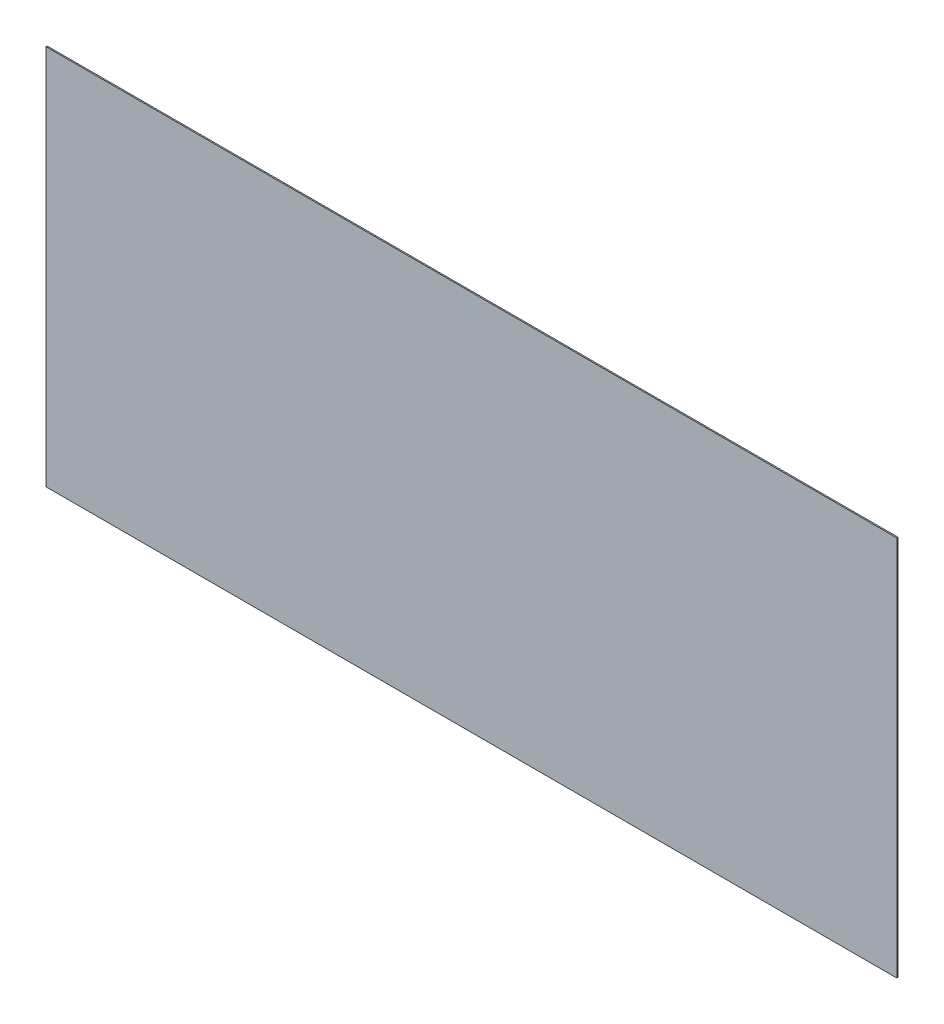
ISO-10303-21;
HEADER;
FILE_DESCRIPTION(('STEP AP214'),'2;1');
FILE_NAME('part.step','',(''),(''),'','','');
FILE_SCHEMA(('AUTOMOTIVE_DESIGN { 1 0 10303 214 1 1 1 1 }'));
ENDSEC;
DATA;
#1=APPLICATION_CONTEXT('core data for automotive mechanical design processes');
#2=APPLICATION_PROTOCOL_DEFINITION('international standard','automotive_design',2000,#1);
#3=PRODUCT_CONTEXT('',#1,'mechanical');
#4=PRODUCT('Part','Part','',(#3));
#5=PRODUCT_RELATED_PRODUCT_CATEGORY('part','',(#4));
#6=PRODUCT_DEFINITION_FORMATION('','',#4);
#7=PRODUCT_DEFINITION_CONTEXT('part definition',#1,'design');
#8=PRODUCT_DEFINITION('design','',#6,#7);
#9=PRODUCT_DEFINITION_SHAPE('','',#8);
#10=(LENGTH_UNIT() NAMED_UNIT(*) SI_UNIT(.MILLI.,.METRE.));
#11=(NAMED_UNIT(*) PLANE_ANGLE_UNIT() SI_UNIT($,.RADIAN.));
#12=(NAMED_UNIT(*) SI_UNIT($,.STERADIAN.) SOLID_ANGLE_UNIT());
#13=UNCERTAINTY_MEASURE_WITH_UNIT(LENGTH_MEASURE(1.E-05),#10,'distance_accuracy_value','');
#14=(GEOMETRIC_REPRESENTATION_CONTEXT(3) GLOBAL_UNCERTAINTY_ASSIGNED_CONTEXT((#13)) GLOBAL_UNIT_ASSIGNED_CONTEXT((#10,
#11,#12)) REPRESENTATION_CONTEXT('',''));
#15=CARTESIAN_POINT('',(0.,0.,0.));
#16=DIRECTION('',(0.,0.,1.));
#17=DIRECTION('',(1.,0.,0.));
#18=AXIS2_PLACEMENT_3D('',#15,#16,#17);
#19=CARTESIAN_POINT('',(125.000000000057,-291534.,151.327));
#20=DIRECTION('',(1.,0.,0.));
#21=DIRECTION('',(0.,1.,0.));
#22=AXIS2_PLACEMENT_3D('',#19,#20,#21);
#23=PLANE('',#22);
#24=DIRECTION('',(0.,0.,-1.));
#25=VECTOR('',#24,1.);
#26=CARTESIAN_POINT('',(125.000000000023,19.0000000000023,161.2));
#27=LINE('',#26,#25);
#28=CARTESIAN_POINT('',(125.000000000023,19.0000000000023,151.327));
#29=VERTEX_POINT('',#28);
#30=CARTESIAN_POINT('',(125.000000000023,19.0000000000023,151.2));
#31=VERTEX_POINT('',#30);
#32=EDGE_CURVE('E92',#29,#31,#27,.T.);
#33=ORIENTED_EDGE('',*,*,#32,.T.);
#34=DIRECTION('',(0.,-1.,0.));
#35=VECTOR('',#34,1.);
#36=CARTESIAN_POINT('',(125.000000000057,-291534.,151.2));
#37=LINE('',#36,#35);
#38=CARTESIAN_POINT('',(125.000000000023,60.0000000000023,151.2));
#39=VERTEX_POINT('',#38);
#40=EDGE_CURVE('E101',#39,#31,#37,.T.);
#41=ORIENTED_EDGE('',*,*,#40,.F.);
#42=DIRECTION('',(0.,0.,-1.));
#43=VECTOR('',#42,1.);
#44=CARTESIAN_POINT('',(125.000000000023,60.0000000000023,151.327));
#45=LINE('',#44,#43);
#46=CARTESIAN_POINT('',(125.000000000023,60.0000000000023,151.327));
#47=VERTEX_POINT('',#46);
#48=EDGE_CURVE('E11',#47,#39,#45,.T.);
#49=ORIENTED_EDGE('',*,*,#48,.F.);
#50=DIRECTION('',(0.,-1.,0.));
#51=VECTOR('',#50,1.);
#52=CARTESIAN_POINT('',(125.000000000057,-291534.,151.327));
#53=LINE('',#52,#51);
#54=EDGE_CURVE('E55',#47,#29,#53,.T.);
#55=ORIENTED_EDGE('',*,*,#54,.T.);
#56=EDGE_LOOP('',(#33,#41,#49,#55));
#57=FACE_BOUND('',#56,.T.);
#58=ADVANCED_FACE('F47',(#57),#23,.T.);
#59=CARTESIAN_POINT('',(-400000.,60.0000000000023,151.327));
#60=DIRECTION('',(0.,1.,0.));
#61=DIRECTION('',(0.,0.,1.));
#62=AXIS2_PLACEMENT_3D('',#59,#60,#61);
#63=PLANE('',#62);
#64=DIRECTION('',(0.,0.,-1.));
#65=VECTOR('',#64,1.);
#66=CARTESIAN_POINT('',(33.5,60.0000000000023,161.2));
#67=LINE('',#66,#65);
#68=CARTESIAN_POINT('',(33.5,60.0000000000023,151.327));
#69=VERTEX_POINT('',#68);
#70=CARTESIAN_POINT('',(33.5,60.0000000000023,151.2));
#71=VERTEX_POINT('',#70);
#72=EDGE_CURVE('E103',#69,#71,#67,.T.);
#73=ORIENTED_EDGE('',*,*,#72,.F.);
#74=DIRECTION('',(1.,0.,0.));
#75=VECTOR('',#74,1.);
#76=CARTESIAN_POINT('',(-400000.,60.0000000000023,151.327));
#77=LINE('',#76,#75);
#78=EDGE_CURVE('E70',#69,#47,#77,.T.);
#79=ORIENTED_EDGE('',*,*,#78,.T.);
#80=ORIENTED_EDGE('',*,*,#48,.T.);
#81=DIRECTION('',(1.,0.,0.));
#82=VECTOR('',#81,1.);
#83=CARTESIAN_POINT('',(-400000.,60.0000000000023,151.2));
#84=LINE('',#83,#82);
#85=EDGE_CURVE('E107',#71,#39,#84,.T.);
#86=ORIENTED_EDGE('',*,*,#85,.F.);
#87=EDGE_LOOP('',(#73,#79,#80,#86));
#88=FACE_BOUND('',#87,.T.);
#89=ADVANCED_FACE('F49',(#88),#63,.T.);
#90=CARTESIAN_POINT('',(0.,0.,151.327));
#91=DIRECTION('',(0.,0.,-1.));
#92=DIRECTION('',(-1.,0.,0.));
#93=AXIS2_PLACEMENT_3D('',#90,#91,#92);
#94=PLANE('',#93);
#95=ORIENTED_EDGE('',*,*,#78,.F.);
#96=DIRECTION('',(0.,-1.,0.));
#97=VECTOR('',#96,1.);
#98=CARTESIAN_POINT('',(33.5,0.,151.327));
#99=LINE('',#98,#97);
#100=CARTESIAN_POINT('',(33.5,19.0000000000023,151.327));
#101=VERTEX_POINT('',#100);
#102=EDGE_CURVE('E109',#69,#101,#99,.T.);
#103=ORIENTED_EDGE('',*,*,#102,.T.);
#104=DIRECTION('',(1.,0.,0.));
#105=VECTOR('',#104,1.);
#106=CARTESIAN_POINT('',(0.,19.0000000000023,151.327));
#107=LINE('',#106,#105);
#108=EDGE_CURVE('E115',#101,#29,#107,.T.);
#109=ORIENTED_EDGE('',*,*,#108,.T.);
#110=ORIENTED_EDGE('',*,*,#54,.F.);
#111=EDGE_LOOP('',(#95,#103,#109,#110));
#112=FACE_BOUND('',#111,.T.);
#113=ADVANCED_FACE('F121',(#112),#94,.F.);
#114=CARTESIAN_POINT('',(0.,0.,151.2));
#115=DIRECTION('',(0.,0.,-1.));
#116=DIRECTION('',(-1.,0.,0.));
#117=AXIS2_PLACEMENT_3D('',#114,#115,#116);
#118=PLANE('',#117);
#119=DIRECTION('',(0.,-1.,0.));
#120=VECTOR('',#119,1.);
#121=CARTESIAN_POINT('',(33.5,60.0000000000023,151.2));
#122=LINE('',#121,#120);
#123=CARTESIAN_POINT('',(33.5,19.0000000000023,151.2));
#124=VERTEX_POINT('',#123);
#125=EDGE_CURVE('E62',#71,#124,#122,.T.);
#126=ORIENTED_EDGE('',*,*,#125,.F.);
#127=ORIENTED_EDGE('',*,*,#85,.T.);
#128=ORIENTED_EDGE('',*,*,#40,.T.);
#129=DIRECTION('',(1.,0.,0.));
#130=VECTOR('',#129,1.);
#131=CARTESIAN_POINT('',(125.000000000023,19.0000000000023,151.2));
#132=LINE('',#131,#130);
#133=EDGE_CURVE('E89',#124,#31,#132,.T.);
#134=ORIENTED_EDGE('',*,*,#133,.F.);
#135=EDGE_LOOP('',(#126,#127,#128,#134));
#136=FACE_BOUND('',#135,.T.);
#137=ADVANCED_FACE('F105',(#136),#118,.T.);
#138=CARTESIAN_POINT('',(33.5,60.0000000000023,161.2));
#139=DIRECTION('',(1.,0.,0.));
#140=DIRECTION('',(0.,1.,0.));
#141=AXIS2_PLACEMENT_3D('',#138,#139,#140);
#142=PLANE('',#141);
#143=ORIENTED_EDGE('',*,*,#72,.T.);
#144=ORIENTED_EDGE('',*,*,#125,.T.);
#145=DIRECTION('',(0.,0.,-1.));
#146=VECTOR('',#145,1.);
#147=CARTESIAN_POINT('',(33.5,19.0000000000023,161.2));
#148=LINE('',#147,#146);
#149=EDGE_CURVE('E94',#101,#124,#148,.T.);
#150=ORIENTED_EDGE('',*,*,#149,.F.);
#151=ORIENTED_EDGE('',*,*,#102,.F.);
#152=EDGE_LOOP('',(#143,#144,#150,#151));
#153=FACE_BOUND('',#152,.T.);
#154=ADVANCED_FACE('F119',(#153),#142,.F.);
#155=CARTESIAN_POINT('',(125.000000000023,19.0000000000023,161.2));
#156=DIRECTION('',(0.,1.,0.));
#157=DIRECTION('',(0.,0.,1.));
#158=AXIS2_PLACEMENT_3D('',#155,#156,#157);
#159=PLANE('',#158);
#160=ORIENTED_EDGE('',*,*,#149,.T.);
#161=ORIENTED_EDGE('',*,*,#133,.T.);
#162=ORIENTED_EDGE('',*,*,#32,.F.);
#163=ORIENTED_EDGE('',*,*,#108,.F.);
#164=EDGE_LOOP('',(#160,#161,#162,#163));
#165=FACE_BOUND('',#164,.T.);
#166=ADVANCED_FACE('F91',(#165),#159,.F.);
#167=CLOSED_SHELL('',(#58,#89,#113,#137,#154,#166));
#168=MANIFOLD_SOLID_BREP('B2',#167);
#169=ADVANCED_BREP_SHAPE_REPRESENTATION('',(#18,#168),#14);
#170=SHAPE_DEFINITION_REPRESENTATION(#9,#169);
ENDSEC;
END-ISO-10303-21;
